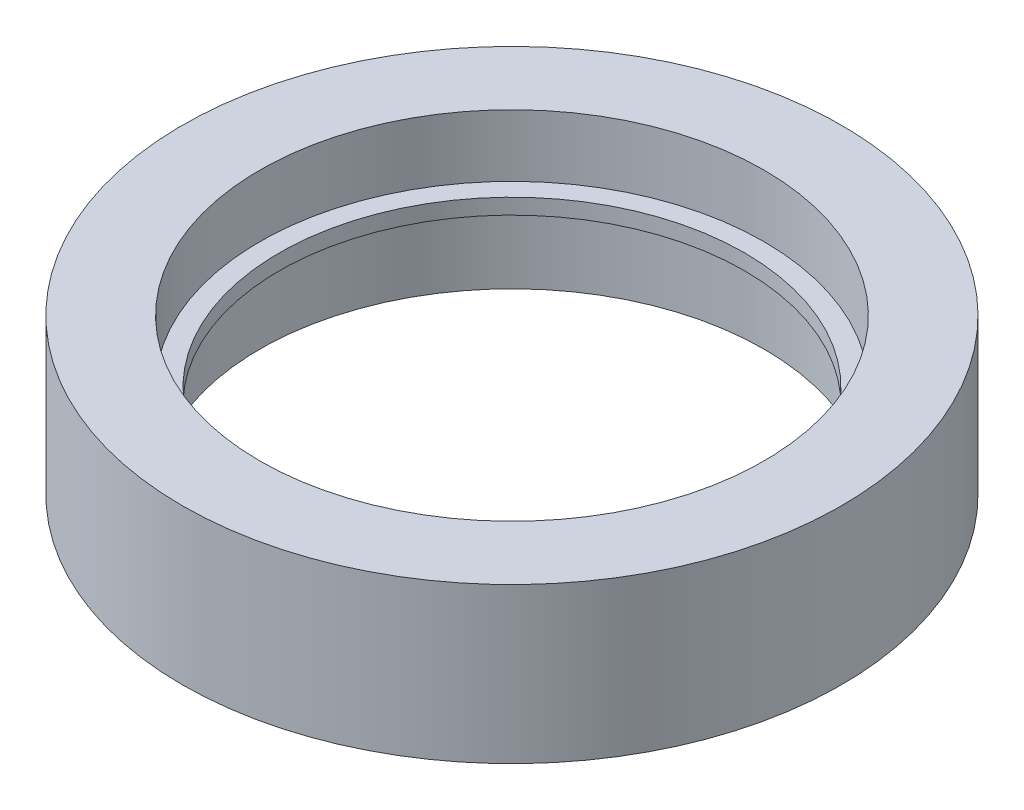
ISO-10303-21;
HEADER;
FILE_DESCRIPTION(('STEP AP214'),'2;1');
FILE_NAME('part.step','',(''),(''),'','','');
FILE_SCHEMA(('AUTOMOTIVE_DESIGN { 1 0 10303 214 1 1 1 1 }'));
ENDSEC;
DATA;
#1=APPLICATION_CONTEXT('core data for automotive mechanical design processes');
#2=APPLICATION_PROTOCOL_DEFINITION('international standard','automotive_design',2000,#1);
#3=PRODUCT_CONTEXT('',#1,'mechanical');
#4=PRODUCT('Part','Part','',(#3));
#5=PRODUCT_RELATED_PRODUCT_CATEGORY('part','',(#4));
#6=PRODUCT_DEFINITION_FORMATION('','',#4);
#7=PRODUCT_DEFINITION_CONTEXT('part definition',#1,'design');
#8=PRODUCT_DEFINITION('design','',#6,#7);
#9=PRODUCT_DEFINITION_SHAPE('','',#8);
#10=(LENGTH_UNIT() NAMED_UNIT(*) SI_UNIT(.MILLI.,.METRE.));
#11=(NAMED_UNIT(*) PLANE_ANGLE_UNIT() SI_UNIT($,.RADIAN.));
#12=(NAMED_UNIT(*) SI_UNIT($,.STERADIAN.) SOLID_ANGLE_UNIT());
#13=UNCERTAINTY_MEASURE_WITH_UNIT(LENGTH_MEASURE(1.E-05),#10,'distance_accuracy_value','');
#14=(GEOMETRIC_REPRESENTATION_CONTEXT(3) GLOBAL_UNCERTAINTY_ASSIGNED_CONTEXT((#13)) GLOBAL_UNIT_ASSIGNED_CONTEXT((#10,
#11,#12)) REPRESENTATION_CONTEXT('',''));
#15=CARTESIAN_POINT('',(0.,0.,0.));
#16=DIRECTION('',(0.,0.,1.));
#17=DIRECTION('',(1.,0.,0.));
#18=AXIS2_PLACEMENT_3D('',#15,#16,#17);
#19=CARTESIAN_POINT('',(0.,20.,0.));
#20=DIRECTION('',(0.,-1.,0.));
#21=DIRECTION('',(0.,0.,-1.));
#22=AXIS2_PLACEMENT_3D('',#19,#20,#21);
#23=CYLINDRICAL_SURFACE('',#22,32.5);
#24=CARTESIAN_POINT('',(0.,0.,0.));
#25=DIRECTION('',(0.,1.,0.));
#26=DIRECTION('',(0.,0.,1.));
#27=AXIS2_PLACEMENT_3D('',#24,#25,#26);
#28=CIRCLE('',#27,32.5);
#29=CARTESIAN_POINT('',(0.,0.,32.5));
#30=VERTEX_POINT('',#29);
#31=EDGE_CURVE('E50',#30,#30,#28,.T.);
#32=ORIENTED_EDGE('',*,*,#31,.F.);
#33=EDGE_LOOP('',(#32));
#34=FACE_BOUND('',#33,.T.);
#35=CARTESIAN_POINT('',(0.,10.,0.));
#36=DIRECTION('',(0.,1.,0.));
#37=DIRECTION('',(0.,0.,1.));
#38=AXIS2_PLACEMENT_3D('',#35,#36,#37);
#39=CIRCLE('',#38,32.5);
#40=CARTESIAN_POINT('',(0.,10.,32.5));
#41=VERTEX_POINT('',#40);
#42=EDGE_CURVE('E52',#41,#41,#39,.T.);
#43=ORIENTED_EDGE('',*,*,#42,.T.);
#44=EDGE_LOOP('',(#43));
#45=FACE_BOUND('',#44,.T.);
#46=ADVANCED_FACE('F31',(#34,#45),#23,.F.);
#47=CARTESIAN_POINT('',(0.,20.,0.));
#48=DIRECTION('',(0.,1.,0.));
#49=DIRECTION('',(0.,0.,1.));
#50=AXIS2_PLACEMENT_3D('',#47,#48,#49);
#51=PLANE('',#50);
#52=CARTESIAN_POINT('',(0.,20.,0.));
#53=DIRECTION('',(0.,1.,0.));
#54=DIRECTION('',(0.,0.,1.));
#55=AXIS2_PLACEMENT_3D('',#52,#53,#54);
#56=CIRCLE('',#55,42.5);
#57=CARTESIAN_POINT('',(0.,20.,42.5));
#58=VERTEX_POINT('',#57);
#59=EDGE_CURVE('E38',#58,#58,#56,.T.);
#60=ORIENTED_EDGE('',*,*,#59,.T.);
#61=EDGE_LOOP('',(#60));
#62=FACE_BOUND('',#61,.T.);
#63=CARTESIAN_POINT('',(0.,20.,0.));
#64=DIRECTION('',(0.,1.,0.));
#65=DIRECTION('',(0.,0.,1.));
#66=AXIS2_PLACEMENT_3D('',#63,#64,#65);
#67=CIRCLE('',#66,32.5);
#68=CARTESIAN_POINT('',(0.,20.,32.5));
#69=VERTEX_POINT('',#68);
#70=EDGE_CURVE('E47',#69,#69,#67,.T.);
#71=ORIENTED_EDGE('',*,*,#70,.F.);
#72=EDGE_LOOP('',(#71));
#73=FACE_BOUND('',#72,.T.);
#74=ADVANCED_FACE('F70',(#62,#73),#51,.T.);
#75=CARTESIAN_POINT('',(0.,0.,0.));
#76=DIRECTION('',(0.,1.,0.));
#77=DIRECTION('',(0.,0.,1.));
#78=AXIS2_PLACEMENT_3D('',#75,#76,#77);
#79=PLANE('',#78);
#80=CARTESIAN_POINT('',(0.,0.,0.));
#81=DIRECTION('',(0.,1.,0.));
#82=DIRECTION('',(0.,0.,1.));
#83=AXIS2_PLACEMENT_3D('',#80,#81,#82);
#84=CIRCLE('',#83,42.5);
#85=CARTESIAN_POINT('',(0.,0.,42.5));
#86=VERTEX_POINT('',#85);
#87=EDGE_CURVE('E42',#86,#86,#84,.T.);
#88=ORIENTED_EDGE('',*,*,#87,.F.);
#89=EDGE_LOOP('',(#88));
#90=FACE_BOUND('',#89,.T.);
#91=ORIENTED_EDGE('',*,*,#31,.T.);
#92=EDGE_LOOP('',(#91));
#93=FACE_BOUND('',#92,.T.);
#94=ADVANCED_FACE('F72',(#90,#93),#79,.F.);
#95=CARTESIAN_POINT('',(0.,20.,0.));
#96=DIRECTION('',(0.,-1.,0.));
#97=DIRECTION('',(0.,0.,-1.));
#98=AXIS2_PLACEMENT_3D('',#95,#96,#97);
#99=CYLINDRICAL_SURFACE('',#98,42.5);
#100=ORIENTED_EDGE('',*,*,#59,.F.);
#101=EDGE_LOOP('',(#100));
#102=FACE_BOUND('',#101,.T.);
#103=ORIENTED_EDGE('',*,*,#87,.T.);
#104=EDGE_LOOP('',(#103));
#105=FACE_BOUND('',#104,.T.);
#106=ADVANCED_FACE('F33',(#102,#105),#99,.T.);
#107=CARTESIAN_POINT('',(0.,12.,0.));
#108=DIRECTION('',(0.,1.,0.));
#109=DIRECTION('',(0.,0.,1.));
#110=AXIS2_PLACEMENT_3D('',#107,#108,#109);
#111=CIRCLE('',#110,32.5);
#112=CARTESIAN_POINT('',(0.,12.,32.5));
#113=VERTEX_POINT('',#112);
#114=EDGE_CURVE('E10',#113,#113,#111,.T.);
#115=ORIENTED_EDGE('',*,*,#114,.F.);
#116=EDGE_LOOP('',(#115));
#117=FACE_BOUND('',#116,.T.);
#118=ORIENTED_EDGE('',*,*,#70,.T.);
#119=EDGE_LOOP('',(#118));
#120=FACE_BOUND('',#119,.T.);
#121=ADVANCED_FACE('F68',(#117,#120),#23,.F.);
#122=CARTESIAN_POINT('',(0.,12.,0.));
#123=DIRECTION('',(0.,1.,0.));
#124=DIRECTION('',(0.,0.,1.));
#125=AXIS2_PLACEMENT_3D('',#122,#123,#124);
#126=PLANE('',#125);
#127=CARTESIAN_POINT('',(0.,12.,0.));
#128=DIRECTION('',(0.,1.,0.));
#129=DIRECTION('',(0.,0.,1.));
#130=AXIS2_PLACEMENT_3D('',#127,#128,#129);
#131=CIRCLE('',#130,30.);
#132=CARTESIAN_POINT('',(0.,12.,30.));
#133=VERTEX_POINT('',#132);
#134=EDGE_CURVE('E54',#133,#133,#131,.T.);
#135=ORIENTED_EDGE('',*,*,#134,.F.);
#136=EDGE_LOOP('',(#135));
#137=FACE_BOUND('',#136,.T.);
#138=ORIENTED_EDGE('',*,*,#114,.T.);
#139=EDGE_LOOP('',(#138));
#140=FACE_BOUND('',#139,.T.);
#141=ADVANCED_FACE('F83',(#137,#140),#126,.T.);
#142=CARTESIAN_POINT('',(0.,10.,0.));
#143=DIRECTION('',(0.,1.,0.));
#144=DIRECTION('',(0.,0.,1.));
#145=AXIS2_PLACEMENT_3D('',#142,#143,#144);
#146=PLANE('',#145);
#147=CARTESIAN_POINT('',(0.,10.,0.));
#148=DIRECTION('',(0.,1.,0.));
#149=DIRECTION('',(0.,0.,1.));
#150=AXIS2_PLACEMENT_3D('',#147,#148,#149);
#151=CIRCLE('',#150,30.);
#152=CARTESIAN_POINT('',(0.,10.,30.));
#153=VERTEX_POINT('',#152);
#154=EDGE_CURVE('E59',#153,#153,#151,.T.);
#155=ORIENTED_EDGE('',*,*,#154,.T.);
#156=EDGE_LOOP('',(#155));
#157=FACE_BOUND('',#156,.T.);
#158=ORIENTED_EDGE('',*,*,#42,.F.);
#159=EDGE_LOOP('',(#158));
#160=FACE_BOUND('',#159,.T.);
#161=ADVANCED_FACE('F85',(#157,#160),#146,.F.);
#162=CARTESIAN_POINT('',(0.,12.,0.));
#163=DIRECTION('',(0.,-1.,0.));
#164=DIRECTION('',(0.,0.,-1.));
#165=AXIS2_PLACEMENT_3D('',#162,#163,#164);
#166=CYLINDRICAL_SURFACE('',#165,30.);
#167=ORIENTED_EDGE('',*,*,#134,.T.);
#168=EDGE_LOOP('',(#167));
#169=FACE_BOUND('',#168,.T.);
#170=ORIENTED_EDGE('',*,*,#154,.F.);
#171=EDGE_LOOP('',(#170));
#172=FACE_BOUND('',#171,.T.);
#173=ADVANCED_FACE('F88',(#169,#172),#166,.F.);
#174=CLOSED_SHELL('',(#46,#74,#94,#106,#121,#141,#161,#173));
#175=MANIFOLD_SOLID_BREP('B2',#174);
#176=ADVANCED_BREP_SHAPE_REPRESENTATION('',(#18,#175),#14);
#177=SHAPE_DEFINITION_REPRESENTATION(#9,#176);
ENDSEC;
END-ISO-10303-21;
